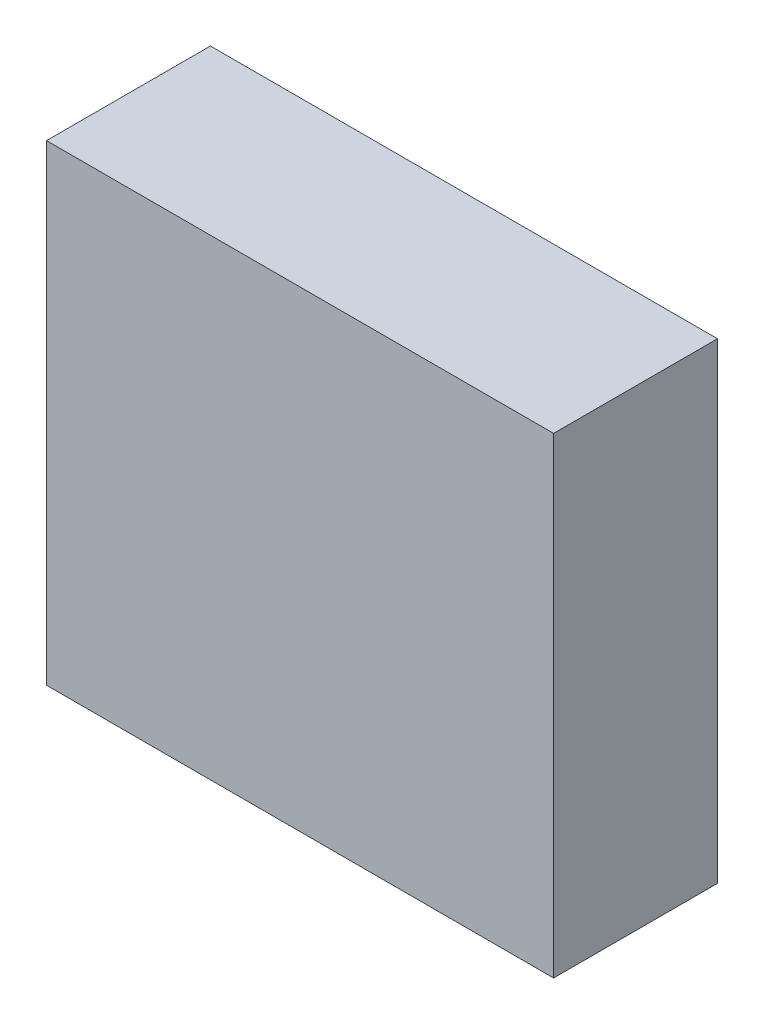
ISO-10303-21;
HEADER;
FILE_DESCRIPTION(('STEP AP214'),'2;1');
FILE_NAME('part.step','',(''),(''),'','','');
FILE_SCHEMA(('AUTOMOTIVE_DESIGN { 1 0 10303 214 1 1 1 1 }'));
ENDSEC;
DATA;
#1=APPLICATION_CONTEXT('core data for automotive mechanical design processes');
#2=APPLICATION_PROTOCOL_DEFINITION('international standard','automotive_design',2000,#1);
#3=PRODUCT_CONTEXT('',#1,'mechanical');
#4=PRODUCT('Part','Part','',(#3));
#5=PRODUCT_RELATED_PRODUCT_CATEGORY('part','',(#4));
#6=PRODUCT_DEFINITION_FORMATION('','',#4);
#7=PRODUCT_DEFINITION_CONTEXT('part definition',#1,'design');
#8=PRODUCT_DEFINITION('design','',#6,#7);
#9=PRODUCT_DEFINITION_SHAPE('','',#8);
#10=(LENGTH_UNIT() NAMED_UNIT(*) SI_UNIT(.MILLI.,.METRE.));
#11=(NAMED_UNIT(*) PLANE_ANGLE_UNIT() SI_UNIT($,.RADIAN.));
#12=(NAMED_UNIT(*) SI_UNIT($,.STERADIAN.) SOLID_ANGLE_UNIT());
#13=UNCERTAINTY_MEASURE_WITH_UNIT(LENGTH_MEASURE(1.E-05),#10,'distance_accuracy_value','');
#14=(GEOMETRIC_REPRESENTATION_CONTEXT(3) GLOBAL_UNCERTAINTY_ASSIGNED_CONTEXT((#13)) GLOBAL_UNIT_ASSIGNED_CONTEXT((#10,
#11,#12)) REPRESENTATION_CONTEXT('',''));
#15=CARTESIAN_POINT('',(0.,0.,0.));
#16=DIRECTION('',(0.,0.,1.));
#17=DIRECTION('',(1.,0.,0.));
#18=AXIS2_PLACEMENT_3D('',#15,#16,#17);
#19=CARTESIAN_POINT('',(1.53799889601104,10.033,1.7018));
#20=DIRECTION('',(-1.,0.,0.));
#21=DIRECTION('',(0.,0.,1.));
#22=AXIS2_PLACEMENT_3D('',#19,#20,#21);
#23=PLANE('',#22);
#24=DIRECTION('',(0.,1.,0.));
#25=VECTOR('',#24,1.);
#26=CARTESIAN_POINT('',(1.53799889601104,7.15491039115941,1.7018));
#27=LINE('',#26,#25);
#28=CARTESIAN_POINT('',(1.53799889601104,7.15491039115941,1.7018));
#29=VERTEX_POINT('',#28);
#30=CARTESIAN_POINT('',(1.53799889601104,10.033,1.7018));
#31=VERTEX_POINT('',#30);
#32=EDGE_CURVE('E107',#29,#31,#27,.T.);
#33=ORIENTED_EDGE('',*,*,#32,.F.);
#34=DIRECTION('',(0.,0.,1.));
#35=VECTOR('',#34,1.);
#36=CARTESIAN_POINT('',(1.53799889601104,7.15491039115941,1.7018));
#37=LINE('',#36,#35);
#38=CARTESIAN_POINT('',(1.53799889601104,7.15491039115941,2.7018));
#39=VERTEX_POINT('',#38);
#40=EDGE_CURVE('E19',#29,#39,#37,.T.);
#41=ORIENTED_EDGE('',*,*,#40,.T.);
#42=DIRECTION('',(0.,-1.,0.));
#43=VECTOR('',#42,1.);
#44=CARTESIAN_POINT('',(1.53799889601104,7.15491039115941,2.7018));
#45=LINE('',#44,#43);
#46=CARTESIAN_POINT('',(1.53799889601104,10.033,2.7018));
#47=VERTEX_POINT('',#46);
#48=EDGE_CURVE('E82',#47,#39,#45,.T.);
#49=ORIENTED_EDGE('',*,*,#48,.F.);
#50=DIRECTION('',(0.,0.,1.));
#51=VECTOR('',#50,1.);
#52=CARTESIAN_POINT('',(1.53799889601104,10.033,1.7018));
#53=LINE('',#52,#51);
#54=EDGE_CURVE('E11',#31,#47,#53,.T.);
#55=ORIENTED_EDGE('',*,*,#54,.F.);
#56=EDGE_LOOP('',(#33,#41,#49,#55));
#57=FACE_BOUND('',#56,.T.);
#58=ADVANCED_FACE('F16',(#57),#23,.T.);
#59=CARTESIAN_POINT('',(4.63209443132124,10.033,1.7018));
#60=DIRECTION('',(0.,1.,0.));
#61=DIRECTION('',(1.,0.,0.));
#62=AXIS2_PLACEMENT_3D('',#59,#60,#61);
#63=PLANE('',#62);
#64=DIRECTION('',(1.,0.,0.));
#65=VECTOR('',#64,1.);
#66=CARTESIAN_POINT('',(1.53799889601104,10.033,1.7018));
#67=LINE('',#66,#65);
#68=CARTESIAN_POINT('',(4.63209443132124,10.033,1.7018));
#69=VERTEX_POINT('',#68);
#70=EDGE_CURVE('E99',#31,#69,#67,.T.);
#71=ORIENTED_EDGE('',*,*,#70,.F.);
#72=ORIENTED_EDGE('',*,*,#54,.T.);
#73=DIRECTION('',(-1.,0.,0.));
#74=VECTOR('',#73,1.);
#75=CARTESIAN_POINT('',(1.53799889601104,10.033,2.7018));
#76=LINE('',#75,#74);
#77=CARTESIAN_POINT('',(4.63209443132124,10.033,2.7018));
#78=VERTEX_POINT('',#77);
#79=EDGE_CURVE('E89',#78,#47,#76,.T.);
#80=ORIENTED_EDGE('',*,*,#79,.F.);
#81=DIRECTION('',(0.,0.,1.));
#82=VECTOR('',#81,1.);
#83=CARTESIAN_POINT('',(4.63209443132124,10.033,1.7018));
#84=LINE('',#83,#82);
#85=EDGE_CURVE('E26',#69,#78,#84,.T.);
#86=ORIENTED_EDGE('',*,*,#85,.F.);
#87=EDGE_LOOP('',(#71,#72,#80,#86));
#88=FACE_BOUND('',#87,.T.);
#89=ADVANCED_FACE('F189',(#88),#63,.T.);
#90=CARTESIAN_POINT('',(4.63209443132124,7.15491039115941,1.7018));
#91=DIRECTION('',(1.,0.,0.));
#92=DIRECTION('',(0.,-1.,0.));
#93=AXIS2_PLACEMENT_3D('',#90,#91,#92);
#94=PLANE('',#93);
#95=DIRECTION('',(0.,-1.,0.));
#96=VECTOR('',#95,1.);
#97=CARTESIAN_POINT('',(4.63209443132124,10.033,1.7018));
#98=LINE('',#97,#96);
#99=CARTESIAN_POINT('',(4.63209443132124,7.15491039115941,1.7018));
#100=VERTEX_POINT('',#99);
#101=EDGE_CURVE('E93',#69,#100,#98,.T.);
#102=ORIENTED_EDGE('',*,*,#101,.F.);
#103=ORIENTED_EDGE('',*,*,#85,.T.);
#104=DIRECTION('',(0.,1.,0.));
#105=VECTOR('',#104,1.);
#106=CARTESIAN_POINT('',(4.63209443132124,10.033,2.7018));
#107=LINE('',#106,#105);
#108=CARTESIAN_POINT('',(4.63209443132124,7.15491039115941,2.7018));
#109=VERTEX_POINT('',#108);
#110=EDGE_CURVE('E84',#109,#78,#107,.T.);
#111=ORIENTED_EDGE('',*,*,#110,.F.);
#112=DIRECTION('',(0.,0.,1.));
#113=VECTOR('',#112,1.);
#114=CARTESIAN_POINT('',(4.63209443132124,7.15491039115941,1.7018));
#115=LINE('',#114,#113);
#116=EDGE_CURVE('E71',#100,#109,#115,.T.);
#117=ORIENTED_EDGE('',*,*,#116,.F.);
#118=EDGE_LOOP('',(#102,#103,#111,#117));
#119=FACE_BOUND('',#118,.T.);
#120=ADVANCED_FACE('F85',(#119),#94,.T.);
#121=CARTESIAN_POINT('',(1.53799889601104,7.15491039115941,1.7018));
#122=DIRECTION('',(0.,-1.,0.));
#123=DIRECTION('',(0.,0.,-1.));
#124=AXIS2_PLACEMENT_3D('',#121,#122,#123);
#125=PLANE('',#124);
#126=DIRECTION('',(-1.,0.,0.));
#127=VECTOR('',#126,1.);
#128=CARTESIAN_POINT('',(4.63209443132124,7.15491039115941,1.7018));
#129=LINE('',#128,#127);
#130=EDGE_CURVE('E77',#100,#29,#129,.T.);
#131=ORIENTED_EDGE('',*,*,#130,.F.);
#132=ORIENTED_EDGE('',*,*,#116,.T.);
#133=DIRECTION('',(1.,0.,0.));
#134=VECTOR('',#133,1.);
#135=CARTESIAN_POINT('',(4.63209443132124,7.15491039115941,2.7018));
#136=LINE('',#135,#134);
#137=EDGE_CURVE('E75',#39,#109,#136,.T.);
#138=ORIENTED_EDGE('',*,*,#137,.F.);
#139=ORIENTED_EDGE('',*,*,#40,.F.);
#140=EDGE_LOOP('',(#131,#132,#138,#139));
#141=FACE_BOUND('',#140,.T.);
#142=ADVANCED_FACE('F73',(#141),#125,.T.);
#143=CARTESIAN_POINT('',(3.08504666366614,8.59395519557972,2.7018));
#144=DIRECTION('',(0.,0.,1.));
#145=DIRECTION('',(1.,0.,0.));
#146=AXIS2_PLACEMENT_3D('',#143,#144,#145);
#147=PLANE('',#146);
#148=ORIENTED_EDGE('',*,*,#137,.T.);
#149=ORIENTED_EDGE('',*,*,#110,.T.);
#150=ORIENTED_EDGE('',*,*,#79,.T.);
#151=ORIENTED_EDGE('',*,*,#48,.T.);
#152=EDGE_LOOP('',(#148,#149,#150,#151));
#153=FACE_BOUND('',#152,.T.);
#154=ADVANCED_FACE('F91',(#153),#147,.T.);
#155=CARTESIAN_POINT('',(3.08504666366614,8.59395519557972,1.7018));
#156=DIRECTION('',(0.,0.,1.));
#157=DIRECTION('',(1.,0.,0.));
#158=AXIS2_PLACEMENT_3D('',#155,#156,#157);
#159=PLANE('',#158);
#160=ORIENTED_EDGE('',*,*,#130,.T.);
#161=ORIENTED_EDGE('',*,*,#32,.T.);
#162=ORIENTED_EDGE('',*,*,#70,.T.);
#163=ORIENTED_EDGE('',*,*,#101,.T.);
#164=EDGE_LOOP('',(#160,#161,#162,#163));
#165=FACE_BOUND('',#164,.T.);
#166=ADVANCED_FACE('F200',(#165),#159,.F.);
#167=CLOSED_SHELL('',(#58,#89,#120,#142,#154,#166));
#168=MANIFOLD_SOLID_BREP('B1',#167);
#169=ADVANCED_BREP_SHAPE_REPRESENTATION('',(#18,#168),#14);
#170=SHAPE_DEFINITION_REPRESENTATION(#9,#169);
ENDSEC;
END-ISO-10303-21;
